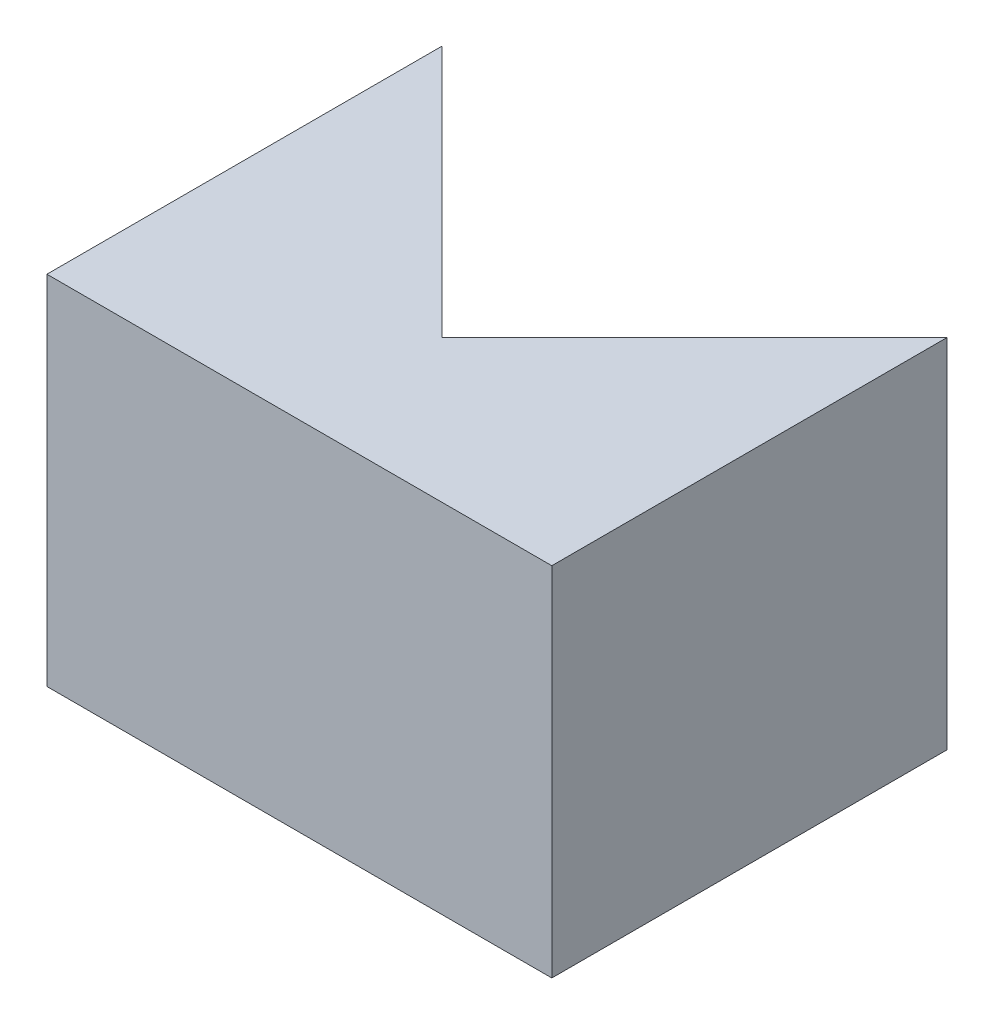
ISO-10303-21;
HEADER;
FILE_DESCRIPTION(('STEP AP214'),'2;1');
FILE_NAME('part.step','',(''),(''),'','','');
FILE_SCHEMA(('AUTOMOTIVE_DESIGN { 1 0 10303 214 1 1 1 1 }'));
ENDSEC;
DATA;
#1=APPLICATION_CONTEXT('core data for automotive mechanical design processes');
#2=APPLICATION_PROTOCOL_DEFINITION('international standard','automotive_design',2000,#1);
#3=PRODUCT_CONTEXT('',#1,'mechanical');
#4=PRODUCT('Part','Part','',(#3));
#5=PRODUCT_RELATED_PRODUCT_CATEGORY('part','',(#4));
#6=PRODUCT_DEFINITION_FORMATION('','',#4);
#7=PRODUCT_DEFINITION_CONTEXT('part definition',#1,'design');
#8=PRODUCT_DEFINITION('design','',#6,#7);
#9=PRODUCT_DEFINITION_SHAPE('','',#8);
#10=(LENGTH_UNIT() NAMED_UNIT(*) SI_UNIT(.MILLI.,.METRE.));
#11=(NAMED_UNIT(*) PLANE_ANGLE_UNIT() SI_UNIT($,.RADIAN.));
#12=(NAMED_UNIT(*) SI_UNIT($,.STERADIAN.) SOLID_ANGLE_UNIT());
#13=UNCERTAINTY_MEASURE_WITH_UNIT(LENGTH_MEASURE(1.E-05),#10,'distance_accuracy_value','');
#14=(GEOMETRIC_REPRESENTATION_CONTEXT(3) GLOBAL_UNCERTAINTY_ASSIGNED_CONTEXT((#13)) GLOBAL_UNIT_ASSIGNED_CONTEXT((#10,
#11,#12)) REPRESENTATION_CONTEXT('',''));
#15=CARTESIAN_POINT('',(0.,0.,0.));
#16=DIRECTION('',(0.,0.,1.));
#17=DIRECTION('',(1.,0.,0.));
#18=AXIS2_PLACEMENT_3D('',#15,#16,#17);
#19=CARTESIAN_POINT('',(-10.57049038721,-12.7865411208349,40.));
#20=DIRECTION('',(0.,1.,0.));
#21=DIRECTION('',(0.,0.,1.));
#22=AXIS2_PLACEMENT_3D('',#19,#20,#21);
#23=PLANE('',#22);
#24=DIRECTION('',(0.,0.,-1.));
#25=VECTOR('',#24,1.);
#26=CARTESIAN_POINT('',(17.70950961279,-12.7865411208349,40.));
#27=LINE('',#26,#25);
#28=CARTESIAN_POINT('',(17.70950961279,-12.7865411208349,22.14));
#29=VERTEX_POINT('',#28);
#30=CARTESIAN_POINT('',(17.70950961279,-12.7865411208349,0.));
#31=VERTEX_POINT('',#30);
#32=EDGE_CURVE('E44',#29,#31,#27,.T.);
#33=ORIENTED_EDGE('',*,*,#32,.F.);
#34=DIRECTION('',(1.,0.,0.));
#35=VECTOR('',#34,1.);
#36=CARTESIAN_POINT('',(-10.57049038721,-12.7865411208349,22.14));
#37=LINE('',#36,#35);
#38=CARTESIAN_POINT('',(-10.57049038721,-12.7865411208349,22.14));
#39=VERTEX_POINT('',#38);
#40=EDGE_CURVE('E145',#39,#29,#37,.T.);
#41=ORIENTED_EDGE('',*,*,#40,.F.);
#42=DIRECTION('',(0.,0.,-1.));
#43=VECTOR('',#42,1.);
#44=CARTESIAN_POINT('',(-10.57049038721,-12.7865411208349,40.));
#45=LINE('',#44,#43);
#46=CARTESIAN_POINT('',(-10.57049038721,-12.7865411208349,0.));
#47=VERTEX_POINT('',#46);
#48=EDGE_CURVE('E105',#39,#47,#45,.T.);
#49=ORIENTED_EDGE('',*,*,#48,.T.);
#50=DIRECTION('',(0.707106781186544,0.,0.707106781186551));
#51=VECTOR('',#50,1.);
#52=CARTESIAN_POINT('',(-10.57049038721,-12.7865411208349,0.));
#53=LINE('',#52,#51);
#54=CARTESIAN_POINT('',(3.56950961278992,-12.7865411208349,14.14));
#55=VERTEX_POINT('',#54);
#56=EDGE_CURVE('E163',#47,#55,#53,.T.);
#57=ORIENTED_EDGE('',*,*,#56,.T.);
#58=DIRECTION('',(0.707106781186549,0.,-0.707106781186546));
#59=VECTOR('',#58,1.);
#60=CARTESIAN_POINT('',(3.56950961278992,-12.7865411208349,14.14));
#61=LINE('',#60,#59);
#62=EDGE_CURVE('E147',#55,#31,#61,.T.);
#63=ORIENTED_EDGE('',*,*,#62,.T.);
#64=EDGE_LOOP('',(#33,#41,#49,#57,#63));
#65=FACE_BOUND('',#64,.T.);
#66=ADVANCED_FACE('F37',(#65),#23,.F.);
#67=CARTESIAN_POINT('',(-10.57049038721,7.21345887916506,40.));
#68=DIRECTION('',(0.,1.,0.));
#69=DIRECTION('',(0.,0.,1.));
#70=AXIS2_PLACEMENT_3D('',#67,#68,#69);
#71=PLANE('',#70);
#72=DIRECTION('',(-1.,0.,0.));
#73=VECTOR('',#72,1.);
#74=CARTESIAN_POINT('',(-10.57049038721,7.21345887916506,22.14));
#75=LINE('',#74,#73);
#76=CARTESIAN_POINT('',(17.70950961279,7.21345887916506,22.14));
#77=VERTEX_POINT('',#76);
#78=CARTESIAN_POINT('',(-10.57049038721,7.21345887916506,22.14));
#79=VERTEX_POINT('',#78);
#80=EDGE_CURVE('E58',#77,#79,#75,.T.);
#81=ORIENTED_EDGE('',*,*,#80,.F.);
#82=DIRECTION('',(0.,0.,-1.));
#83=VECTOR('',#82,1.);
#84=CARTESIAN_POINT('',(17.70950961279,7.21345887916506,40.));
#85=LINE('',#84,#83);
#86=CARTESIAN_POINT('',(17.70950961279,7.21345887916506,0.));
#87=VERTEX_POINT('',#86);
#88=EDGE_CURVE('E115',#77,#87,#85,.T.);
#89=ORIENTED_EDGE('',*,*,#88,.T.);
#90=DIRECTION('',(-0.707106781186549,0.,0.707106781186546));
#91=VECTOR('',#90,1.);
#92=CARTESIAN_POINT('',(-16.43049038721,7.21345887916506,34.1399999999999));
#93=LINE('',#92,#91);
#94=CARTESIAN_POINT('',(3.56950961278992,7.21345887916506,14.14));
#95=VERTEX_POINT('',#94);
#96=EDGE_CURVE('E156',#87,#95,#93,.T.);
#97=ORIENTED_EDGE('',*,*,#96,.T.);
#98=DIRECTION('',(-0.707106781186544,0.,-0.707106781186551));
#99=VECTOR('',#98,1.);
#100=CARTESIAN_POINT('',(9.42950961279002,7.21345887916506,20.0000000000002));
#101=LINE('',#100,#99);
#102=CARTESIAN_POINT('',(-10.57049038721,7.21345887916506,0.));
#103=VERTEX_POINT('',#102);
#104=EDGE_CURVE('E153',#95,#103,#101,.T.);
#105=ORIENTED_EDGE('',*,*,#104,.T.);
#106=DIRECTION('',(0.,0.,-1.));
#107=VECTOR('',#106,1.);
#108=CARTESIAN_POINT('',(-10.57049038721,7.21345887916506,40.));
#109=LINE('',#108,#107);
#110=EDGE_CURVE('E113',#79,#103,#109,.T.);
#111=ORIENTED_EDGE('',*,*,#110,.F.);
#112=EDGE_LOOP('',(#81,#89,#97,#105,#111));
#113=FACE_BOUND('',#112,.T.);
#114=ADVANCED_FACE('F137',(#113),#71,.T.);
#115=CARTESIAN_POINT('',(17.70950961279,7.21345887916506,40.));
#116=DIRECTION('',(1.,0.,0.));
#117=DIRECTION('',(0.,0.,-1.));
#118=AXIS2_PLACEMENT_3D('',#115,#116,#117);
#119=PLANE('',#118);
#120=DIRECTION('',(0.,-1.,0.));
#121=VECTOR('',#120,1.);
#122=CARTESIAN_POINT('',(17.70950961279,16.2134588791651,22.14));
#123=LINE('',#122,#121);
#124=EDGE_CURVE('E152',#77,#29,#123,.T.);
#125=ORIENTED_EDGE('',*,*,#124,.T.);
#126=ORIENTED_EDGE('',*,*,#32,.T.);
#127=DIRECTION('',(0.,-1.,0.));
#128=VECTOR('',#127,1.);
#129=CARTESIAN_POINT('',(17.70950961279,7.21345887916506,0.));
#130=LINE('',#129,#128);
#131=EDGE_CURVE('E117',#87,#31,#130,.T.);
#132=ORIENTED_EDGE('',*,*,#131,.F.);
#133=ORIENTED_EDGE('',*,*,#88,.F.);
#134=EDGE_LOOP('',(#125,#126,#132,#133));
#135=FACE_BOUND('',#134,.T.);
#136=ADVANCED_FACE('F100',(#135),#119,.T.);
#137=CARTESIAN_POINT('',(-10.57049038721,7.21345887916506,40.));
#138=DIRECTION('',(1.,0.,0.));
#139=DIRECTION('',(0.,0.,-1.));
#140=AXIS2_PLACEMENT_3D('',#137,#138,#139);
#141=PLANE('',#140);
#142=DIRECTION('',(0.,1.,0.));
#143=VECTOR('',#142,1.);
#144=CARTESIAN_POINT('',(-10.57049038721,7.21345887916506,9.89949493661172));
#145=LINE('',#144,#143);
#146=CARTESIAN_POINT('',(-10.57049038721,-6.78767326107844,9.89949493661172));
#147=VERTEX_POINT('',#146);
#148=CARTESIAN_POINT('',(-10.57049038721,1.21459101940855,9.89949493661172));
#149=VERTEX_POINT('',#148);
#150=EDGE_CURVE('E87',#147,#149,#145,.T.);
#151=ORIENTED_EDGE('',*,*,#150,.T.);
#152=CARTESIAN_POINT('',(-10.57049038721,-2.78654112083494,14.1399999999999));
#153=DIRECTION('',(1.,0.,0.));
#154=DIRECTION('',(0.,0.,-1.));
#155=AXIS2_PLACEMENT_3D('',#152,#153,#154);
#156=ELLIPSE('',#155,7.07106781186544,5.);
#157=EDGE_CURVE('E11',#149,#147,#156,.T.);
#158=ORIENTED_EDGE('',*,*,#157,.T.);
#159=EDGE_LOOP('',(#151,#158));
#160=FACE_BOUND('',#159,.T.);
#161=ORIENTED_EDGE('',*,*,#48,.F.);
#162=DIRECTION('',(0.,-1.,0.));
#163=VECTOR('',#162,1.);
#164=CARTESIAN_POINT('',(-10.57049038721,16.2134588791651,22.14));
#165=LINE('',#164,#163);
#166=EDGE_CURVE('E107',#79,#39,#165,.T.);
#167=ORIENTED_EDGE('',*,*,#166,.F.);
#168=ORIENTED_EDGE('',*,*,#110,.T.);
#169=DIRECTION('',(0.,-1.,0.));
#170=VECTOR('',#169,1.);
#171=CARTESIAN_POINT('',(-10.57049038721,7.21345887916506,0.));
#172=LINE('',#171,#170);
#173=EDGE_CURVE('E109',#103,#47,#172,.T.);
#174=ORIENTED_EDGE('',*,*,#173,.T.);
#175=EDGE_LOOP('',(#161,#167,#168,#174));
#176=FACE_BOUND('',#175,.T.);
#177=ADVANCED_FACE('F96',(#160,#176),#141,.F.);
#178=CARTESIAN_POINT('',(3.56950961278992,16.2134588791651,14.14));
#179=DIRECTION('',(-0.707106781186546,0.,-0.707106781186549));
#180=DIRECTION('',(-0.707106781186549,0.,0.707106781186546));
#181=AXIS2_PLACEMENT_3D('',#178,#179,#180);
#182=PLANE('',#181);
#183=ORIENTED_EDGE('',*,*,#131,.T.);
#184=ORIENTED_EDGE('',*,*,#62,.F.);
#185=DIRECTION('',(0.,-1.,0.));
#186=VECTOR('',#185,1.);
#187=CARTESIAN_POINT('',(3.56950961278992,16.2134588791651,14.14));
#188=LINE('',#187,#186);
#189=EDGE_CURVE('E161',#95,#55,#188,.T.);
#190=ORIENTED_EDGE('',*,*,#189,.F.);
#191=ORIENTED_EDGE('',*,*,#96,.F.);
#192=EDGE_LOOP('',(#183,#184,#190,#191));
#193=FACE_BOUND('',#192,.T.);
#194=ADVANCED_FACE('F99',(#193),#182,.T.);
#195=CARTESIAN_POINT('',(-10.57049038721,16.2134588791651,0.));
#196=DIRECTION('',(0.707106781186551,0.,-0.707106781186544));
#197=DIRECTION('',(-0.707106781186544,0.,-0.707106781186551));
#198=AXIS2_PLACEMENT_3D('',#195,#196,#197);
#199=PLANE('',#198);
#200=CARTESIAN_POINT('',(-3.50049038721003,-2.78654112083494,7.07000000000003));
#201=DIRECTION('',(0.707106781186551,0.,-0.707106781186544));
#202=DIRECTION('',(-0.707106781186544,0.,-0.707106781186551));
#203=AXIS2_PLACEMENT_3D('',#200,#201,#202);
#204=CIRCLE('',#203,2.675);
#205=CARTESIAN_POINT('',(-5.39200102688404,-2.78654112083494,5.178489360326));
#206=VERTEX_POINT('',#205);
#207=EDGE_CURVE('E90',#206,#206,#204,.T.);
#208=ORIENTED_EDGE('',*,*,#207,.F.);
#209=EDGE_LOOP('',(#208));
#210=FACE_BOUND('',#209,.T.);
#211=ORIENTED_EDGE('',*,*,#189,.T.);
#212=ORIENTED_EDGE('',*,*,#56,.F.);
#213=ORIENTED_EDGE('',*,*,#173,.F.);
#214=ORIENTED_EDGE('',*,*,#104,.F.);
#215=EDGE_LOOP('',(#211,#212,#213,#214));
#216=FACE_BOUND('',#215,.T.);
#217=ADVANCED_FACE('F171',(#210,#216),#199,.T.);
#218=CARTESIAN_POINT('',(-10.57049038721,16.2134588791651,22.14));
#219=DIRECTION('',(0.,0.,-1.));
#220=DIRECTION('',(-1.,0.,0.));
#221=AXIS2_PLACEMENT_3D('',#218,#219,#220);
#222=PLANE('',#221);
#223=ORIENTED_EDGE('',*,*,#80,.T.);
#224=ORIENTED_EDGE('',*,*,#166,.T.);
#225=ORIENTED_EDGE('',*,*,#40,.T.);
#226=ORIENTED_EDGE('',*,*,#124,.F.);
#227=EDGE_LOOP('',(#223,#224,#225,#226));
#228=FACE_BOUND('',#227,.T.);
#229=ADVANCED_FACE('F173',(#228),#222,.F.);
#230=CARTESIAN_POINT('',(-16.9355192297545,-2.78654112083494,20.5050288425444));
#231=DIRECTION('',(0.707106781186551,0.,-0.707106781186544));
#232=DIRECTION('',(-0.707106781186544,0.,-0.707106781186551));
#233=AXIS2_PLACEMENT_3D('',#230,#231,#232);
#234=CYLINDRICAL_SURFACE('',#233,2.675);
#235=CARTESIAN_POINT('',(-8.45023785551589,-2.78654112083494,12.0197474683058));
#236=DIRECTION('',(0.707106781186551,0.,-0.707106781186544));
#237=DIRECTION('',(-0.707106781186544,0.,-0.707106781186551));
#238=AXIS2_PLACEMENT_3D('',#235,#236,#237);
#239=CIRCLE('',#238,2.675);
#240=CARTESIAN_POINT('',(-10.3417484951899,-2.78654112083494,10.1282368286318));
#241=VERTEX_POINT('',#240);
#242=EDGE_CURVE('E91',#241,#241,#239,.F.);
#243=ORIENTED_EDGE('',*,*,#242,.T.);
#244=EDGE_LOOP('',(#243));
#245=FACE_BOUND('',#244,.T.);
#246=ORIENTED_EDGE('',*,*,#207,.T.);
#247=EDGE_LOOP('',(#246));
#248=FACE_BOUND('',#247,.T.);
#249=ADVANCED_FACE('F127',(#245,#248),#234,.F.);
#250=CARTESIAN_POINT('',(-21.8852666980604,-2.78654112083494,25.4547763108502));
#251=DIRECTION('',(0.707106781186551,0.,-0.707106781186544));
#252=DIRECTION('',(-0.707106781186544,0.,-0.707106781186551));
#253=AXIS2_PLACEMENT_3D('',#250,#251,#252);
#254=CYLINDRICAL_SURFACE('',#253,5.);
#255=CARTESIAN_POINT('',(-8.45023785551589,-2.78654112083494,12.0197474683058));
#256=DIRECTION('',(0.707106781186551,0.,-0.707106781186544));
#257=DIRECTION('',(-0.707106781186544,0.,-0.707106781186551));
#258=AXIS2_PLACEMENT_3D('',#255,#256,#257);
#259=CIRCLE('',#258,5.);
#260=EDGE_CURVE('E50',#149,#147,#259,.T.);
#261=ORIENTED_EDGE('',*,*,#260,.T.);
#262=ORIENTED_EDGE('',*,*,#157,.F.);
#263=EDGE_LOOP('',(#261,#262));
#264=FACE_BOUND('',#263,.T.);
#265=ADVANCED_FACE('F94',(#264),#254,.F.);
#266=CARTESIAN_POINT('',(-8.45023785551589,-2.78654112083494,12.0197474683058));
#267=DIRECTION('',(0.707106781186551,0.,-0.707106781186544));
#268=DIRECTION('',(-0.707106781186544,0.,-0.707106781186551));
#269=AXIS2_PLACEMENT_3D('',#266,#267,#268);
#270=PLANE('',#269);
#271=ORIENTED_EDGE('',*,*,#242,.F.);
#272=EDGE_LOOP('',(#271));
#273=FACE_BOUND('',#272,.T.);
#274=ORIENTED_EDGE('',*,*,#260,.F.);
#275=ORIENTED_EDGE('',*,*,#150,.F.);
#276=EDGE_LOOP('',(#274,#275));
#277=FACE_BOUND('',#276,.T.);
#278=ADVANCED_FACE('F88',(#273,#277),#270,.F.);
#279=CLOSED_SHELL('',(#66,#114,#136,#177,#194,#217,#229,#249,#265,#278));
#280=MANIFOLD_SOLID_BREP('B2',#279);
#281=ADVANCED_BREP_SHAPE_REPRESENTATION('',(#18,#280),#14);
#282=SHAPE_DEFINITION_REPRESENTATION(#9,#281);
ENDSEC;
END-ISO-10303-21;
